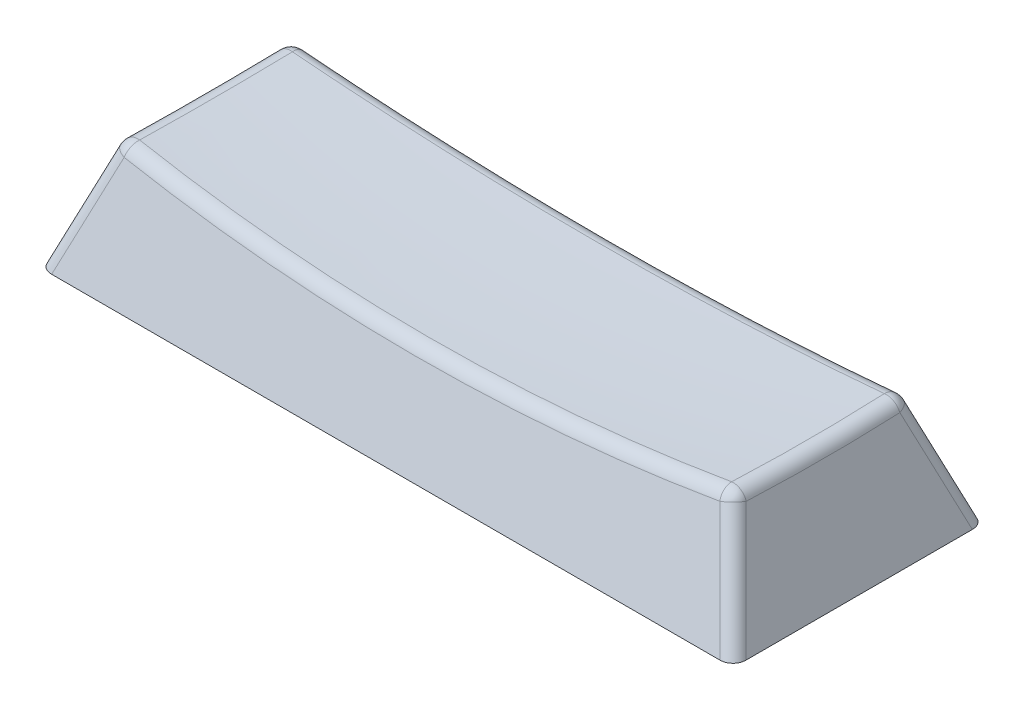
ISO-10303-21;
HEADER;
FILE_DESCRIPTION(('STEP AP214'),'2;1');
FILE_NAME('part.step','',(''),(''),'','','');
FILE_SCHEMA(('AUTOMOTIVE_DESIGN { 1 0 10303 214 1 1 1 1 }'));
ENDSEC;
DATA;
#1=APPLICATION_CONTEXT('core data for automotive mechanical design processes');
#2=APPLICATION_PROTOCOL_DEFINITION('international standard','automotive_design',2000,#1);
#3=PRODUCT_CONTEXT('',#1,'mechanical');
#4=PRODUCT('Part','Part','',(#3));
#5=PRODUCT_RELATED_PRODUCT_CATEGORY('part','',(#4));
#6=PRODUCT_DEFINITION_FORMATION('','',#4);
#7=PRODUCT_DEFINITION_CONTEXT('part definition',#1,'design');
#8=PRODUCT_DEFINITION('design','',#6,#7);
#9=PRODUCT_DEFINITION_SHAPE('','',#8);
#10=(LENGTH_UNIT() NAMED_UNIT(*) SI_UNIT(.MILLI.,.METRE.));
#11=(NAMED_UNIT(*) PLANE_ANGLE_UNIT() SI_UNIT($,.RADIAN.));
#12=(NAMED_UNIT(*) SI_UNIT($,.STERADIAN.) SOLID_ANGLE_UNIT());
#13=UNCERTAINTY_MEASURE_WITH_UNIT(LENGTH_MEASURE(1.E-05),#10,'distance_accuracy_value','');
#14=(GEOMETRIC_REPRESENTATION_CONTEXT(3) GLOBAL_UNCERTAINTY_ASSIGNED_CONTEXT((#13)) GLOBAL_UNIT_ASSIGNED_CONTEXT((#10,
#11,#12)) REPRESENTATION_CONTEXT('',''));
#15=CARTESIAN_POINT('',(0.,0.,0.));
#16=DIRECTION('',(0.,0.,1.));
#17=DIRECTION('',(1.,0.,0.));
#18=AXIS2_PLACEMENT_3D('',#15,#16,#17);
#19=CARTESIAN_POINT('',(-24.75,0.,9.));
#20=DIRECTION('',(-0.941470544812038,0.337095258423083,0.));
#21=DIRECTION('',(-0.337095258423083,-0.941470544812038,0.));
#22=AXIS2_PLACEMENT_3D('',#19,#20,#21);
#23=PLANE('',#22);
#24=DIRECTION('',(0.,0.,1.));
#25=VECTOR('',#24,1.);
#26=CARTESIAN_POINT('',(-24.75,0.,9.));
#27=LINE('',#26,#25);
#28=CARTESIAN_POINT('',(-24.75,0.,-8.05852945518796));
#29=VERTEX_POINT('',#28);
#30=CARTESIAN_POINT('',(-24.75,0.,8.05852945518797));
#31=VERTEX_POINT('',#30);
#32=EDGE_CURVE('E332',#29,#31,#27,.T.);
#33=ORIENTED_EDGE('',*,*,#32,.T.);
#34=DIRECTION('',(0.319434306340419,0.892145418564502,-0.31943430634042));
#35=VECTOR('',#34,1.);
#36=CARTESIAN_POINT('',(-24.8460660313606,-0.268302020343255,8.15459548654862));
#37=LINE('',#36,#35);
#38=CARTESIAN_POINT('',(-22.1671326449072,7.2136687633988,5.47566210009516));
#39=VERTEX_POINT('',#38);
#40=EDGE_CURVE('E364',#31,#39,#37,.T.);
#41=ORIENTED_EDGE('',*,*,#40,.T.);
#42=CARTESIAN_POINT('',(30.8648031415513,155.326121340973,0.));
#43=DIRECTION('',(-0.941470544812038,0.337095258423083,0.));
#44=DIRECTION('',(-0.337095258423083,-0.941470544812038,0.));
#45=AXIS2_PLACEMENT_3D('',#42,#43,#44);
#46=CIRCLE('',#45,157.415589117589);
#47=CARTESIAN_POINT('',(-22.1671326449072,7.21366876339883,-5.47566210009517));
#48=VERTEX_POINT('',#47);
#49=EDGE_CURVE('E360',#39,#48,#46,.F.);
#50=ORIENTED_EDGE('',*,*,#49,.T.);
#51=DIRECTION('',(0.319434306340419,0.892145418564502,0.319434306340419));
#52=VECTOR('',#51,1.);
#53=CARTESIAN_POINT('',(-23.0093770621513,4.86137133246757,-6.31790651733929));
#54=LINE('',#53,#52);
#55=EDGE_CURVE('E362',#48,#29,#54,.F.);
#56=ORIENTED_EDGE('',*,*,#55,.T.);
#57=EDGE_LOOP('',(#33,#41,#50,#56));
#58=FACE_BOUND('',#57,.T.);
#59=ADVANCED_FACE('F35',(#58),#23,.T.);
#60=CARTESIAN_POINT('',(24.75,0.,9.));
#61=DIRECTION('',(0.,0.337095258423083,0.941470544812038));
#62=DIRECTION('',(0.,-0.941470544812038,0.337095258423083));
#63=AXIS2_PLACEMENT_3D('',#60,#61,#62);
#64=PLANE('',#63);
#65=CARTESIAN_POINT('',(0.,150.327618549506,-44.8250800328429));
#66=DIRECTION('',(0.,0.337095258423083,0.941470544812038));
#67=DIRECTION('',(0.,-0.941470544812038,0.337095258423083));
#68=AXIS2_PLACEMENT_3D('',#65,#66,#67);
#69=CIRCLE('',#68,153.485816006169);
#70=CARTESIAN_POINT('',(21.2256621000952,7.2136687633988,6.4171326449072));
#71=VERTEX_POINT('',#70);
#72=CARTESIAN_POINT('',(-21.2256621000952,7.21366876339878,6.41713264490721));
#73=VERTEX_POINT('',#72);
#74=EDGE_CURVE('E347',#71,#73,#69,.F.);
#75=ORIENTED_EDGE('',*,*,#74,.T.);
#76=DIRECTION('',(0.31943430634042,0.892145418564502,-0.31943430634042));
#77=VECTOR('',#76,1.);
#78=CARTESIAN_POINT('',(-18.853700821223,13.8382996998865,4.045171366035));
#79=LINE('',#78,#77);
#80=CARTESIAN_POINT('',(-23.808529455188,0.,9.));
#81=VERTEX_POINT('',#80);
#82=EDGE_CURVE('E349',#73,#81,#79,.F.);
#83=ORIENTED_EDGE('',*,*,#82,.T.);
#84=DIRECTION('',(1.,0.,0.));
#85=VECTOR('',#84,1.);
#86=CARTESIAN_POINT('',(24.75,0.,9.));
#87=LINE('',#86,#85);
#88=CARTESIAN_POINT('',(23.808529455188,0.,9.));
#89=VERTEX_POINT('',#88);
#90=EDGE_CURVE('E335',#81,#89,#87,.T.);
#91=ORIENTED_EDGE('',*,*,#90,.T.);
#92=DIRECTION('',(-0.319434306340419,0.892145418564502,-0.319434306340419));
#93=VECTOR('',#92,1.);
#94=CARTESIAN_POINT('',(23.9045954865486,-0.268302020343256,9.09606603136065));
#95=LINE('',#94,#93);
#96=EDGE_CURVE('E345',#89,#71,#95,.T.);
#97=ORIENTED_EDGE('',*,*,#96,.T.);
#98=EDGE_LOOP('',(#75,#83,#91,#97));
#99=FACE_BOUND('',#98,.T.);
#100=ADVANCED_FACE('F455',(#99),#64,.T.);
#101=CARTESIAN_POINT('',(24.75,0.,9.));
#102=DIRECTION('',(0.941470544812038,0.337095258423083,0.));
#103=DIRECTION('',(-0.337095258423083,0.941470544812038,0.));
#104=AXIS2_PLACEMENT_3D('',#101,#102,#103);
#105=PLANE('',#104);
#106=CARTESIAN_POINT('',(-30.8648031415513,155.326121340973,0.));
#107=DIRECTION('',(0.941470544812038,0.337095258423083,0.));
#108=DIRECTION('',(-0.337095258423083,0.941470544812038,0.));
#109=AXIS2_PLACEMENT_3D('',#106,#107,#108);
#110=CIRCLE('',#109,157.415589117589);
#111=CARTESIAN_POINT('',(22.1671326449072,7.21366876339878,-5.47566210009518));
#112=VERTEX_POINT('',#111);
#113=CARTESIAN_POINT('',(22.1671326449072,7.21366876339882,5.47566210009517));
#114=VERTEX_POINT('',#113);
#115=EDGE_CURVE('E383',#112,#114,#110,.F.);
#116=ORIENTED_EDGE('',*,*,#115,.T.);
#117=DIRECTION('',(-0.319434306340419,0.892145418564502,-0.319434306340419));
#118=VECTOR('',#117,1.);
#119=CARTESIAN_POINT('',(24.8460660313607,-0.268302020343255,8.15459548654861));
#120=LINE('',#119,#118);
#121=CARTESIAN_POINT('',(24.75,0.,8.05852945518796));
#122=VERTEX_POINT('',#121);
#123=EDGE_CURVE('E43',#114,#122,#120,.F.);
#124=ORIENTED_EDGE('',*,*,#123,.T.);
#125=DIRECTION('',(0.,0.,-1.));
#126=VECTOR('',#125,1.);
#127=CARTESIAN_POINT('',(24.75,0.,9.));
#128=LINE('',#127,#126);
#129=CARTESIAN_POINT('',(24.75,0.,-8.05852945518797));
#130=VERTEX_POINT('',#129);
#131=EDGE_CURVE('E339',#122,#130,#128,.T.);
#132=ORIENTED_EDGE('',*,*,#131,.T.);
#133=DIRECTION('',(-0.319434306340419,0.892145418564502,0.31943430634042));
#134=VECTOR('',#133,1.);
#135=CARTESIAN_POINT('',(23.0093770621513,4.86137133246757,-6.31790651733929));
#136=LINE('',#135,#134);
#137=EDGE_CURVE('E381',#130,#112,#136,.T.);
#138=ORIENTED_EDGE('',*,*,#137,.T.);
#139=EDGE_LOOP('',(#116,#124,#132,#138));
#140=FACE_BOUND('',#139,.T.);
#141=ADVANCED_FACE('F443',(#140),#105,.T.);
#142=CARTESIAN_POINT('',(24.75,0.,-9.));
#143=DIRECTION('',(0.,0.337095258423083,-0.941470544812038));
#144=DIRECTION('',(0.,0.941470544812038,0.337095258423083));
#145=AXIS2_PLACEMENT_3D('',#142,#143,#144);
#146=PLANE('',#145);
#147=DIRECTION('',(-1.,0.,0.));
#148=VECTOR('',#147,1.);
#149=CARTESIAN_POINT('',(24.75,0.,-9.));
#150=LINE('',#149,#148);
#151=CARTESIAN_POINT('',(23.808529455188,0.,-9.));
#152=VERTEX_POINT('',#151);
#153=CARTESIAN_POINT('',(-23.808529455188,0.,-9.));
#154=VERTEX_POINT('',#153);
#155=EDGE_CURVE('E342',#152,#154,#150,.T.);
#156=ORIENTED_EDGE('',*,*,#155,.T.);
#157=DIRECTION('',(0.319434306340419,0.892145418564502,0.319434306340419));
#158=VECTOR('',#157,1.);
#159=CARTESIAN_POINT('',(-18.853700821223,13.8382996998865,-4.045171366035));
#160=LINE('',#159,#158);
#161=CARTESIAN_POINT('',(-21.2256621000952,7.21366876339879,-6.41713264490721));
#162=VERTEX_POINT('',#161);
#163=EDGE_CURVE('E370',#154,#162,#160,.T.);
#164=ORIENTED_EDGE('',*,*,#163,.T.);
#165=CARTESIAN_POINT('',(0.,150.327618549506,44.8250800328429));
#166=DIRECTION('',(0.,0.337095258423083,-0.941470544812038));
#167=DIRECTION('',(0.,0.941470544812038,0.337095258423083));
#168=AXIS2_PLACEMENT_3D('',#165,#166,#167);
#169=CIRCLE('',#168,153.485816006169);
#170=CARTESIAN_POINT('',(21.2256621000952,7.2136687633988,-6.41713264490721));
#171=VERTEX_POINT('',#170);
#172=EDGE_CURVE('E368',#162,#171,#169,.F.);
#173=ORIENTED_EDGE('',*,*,#172,.T.);
#174=DIRECTION('',(-0.31943430634042,0.892145418564502,0.31943430634042));
#175=VECTOR('',#174,1.);
#176=CARTESIAN_POINT('',(23.9045954865486,-0.268302020343257,-9.09606603136066));
#177=LINE('',#176,#175);
#178=EDGE_CURVE('E366',#171,#152,#177,.F.);
#179=ORIENTED_EDGE('',*,*,#178,.T.);
#180=EDGE_LOOP('',(#156,#164,#173,#179));
#181=FACE_BOUND('',#180,.T.);
#182=ADVANCED_FACE('F498',(#181),#146,.T.);
#183=CARTESIAN_POINT('',(0.,0.,0.));
#184=DIRECTION('',(0.,1.,0.));
#185=DIRECTION('',(0.,0.,1.));
#186=AXIS2_PLACEMENT_3D('',#183,#184,#185);
#187=PLANE('',#186);
#188=DIRECTION('',(0.,0.,-1.));
#189=VECTOR('',#188,1.);
#190=CARTESIAN_POINT('',(-23.1567478177987,0.,9.));
#191=LINE('',#190,#189);
#192=CARTESIAN_POINT('',(-23.1567478177987,0.,-7.40674781779872));
#193=VERTEX_POINT('',#192);
#194=CARTESIAN_POINT('',(-23.1567478177987,0.,7.40674781779873));
#195=VERTEX_POINT('',#194);
#196=EDGE_CURVE('E318',#193,#195,#191,.F.);
#197=ORIENTED_EDGE('',*,*,#196,.T.);
#198=DIRECTION('',(-1.,0.,0.));
#199=VECTOR('',#198,1.);
#200=CARTESIAN_POINT('',(24.75,0.,7.40674781779872));
#201=LINE('',#200,#199);
#202=CARTESIAN_POINT('',(23.1567478177987,0.,7.40674781779872));
#203=VERTEX_POINT('',#202);
#204=EDGE_CURVE('E326',#195,#203,#201,.F.);
#205=ORIENTED_EDGE('',*,*,#204,.T.);
#206=DIRECTION('',(0.,0.,1.));
#207=VECTOR('',#206,1.);
#208=CARTESIAN_POINT('',(23.1567478177987,0.,9.));
#209=LINE('',#208,#207);
#210=CARTESIAN_POINT('',(23.1567478177987,0.,-7.40674781779873));
#211=VERTEX_POINT('',#210);
#212=EDGE_CURVE('E328',#203,#211,#209,.F.);
#213=ORIENTED_EDGE('',*,*,#212,.T.);
#214=DIRECTION('',(1.,0.,0.));
#215=VECTOR('',#214,1.);
#216=CARTESIAN_POINT('',(24.75,0.,-7.40674781779873));
#217=LINE('',#216,#215);
#218=EDGE_CURVE('E214',#211,#193,#217,.F.);
#219=ORIENTED_EDGE('',*,*,#218,.T.);
#220=EDGE_LOOP('',(#197,#205,#213,#219));
#221=FACE_BOUND('',#220,.T.);
#222=ORIENTED_EDGE('',*,*,#90,.F.);
#223=CARTESIAN_POINT('',(-23.6878318785325,0.,7.93783187853249));
#224=DIRECTION('',(0.,1.,0.));
#225=DIRECTION('',(-0.707106781186547,0.,0.707106781186548));
#226=AXIS2_PLACEMENT_3D('',#223,#224,#225);
#227=ELLIPSE('',#226,1.12089349918878,1.);
#228=EDGE_CURVE('E358',#81,#31,#227,.F.);
#229=ORIENTED_EDGE('',*,*,#228,.T.);
#230=ORIENTED_EDGE('',*,*,#32,.F.);
#231=CARTESIAN_POINT('',(-23.6878318785325,0.,-7.93783187853249));
#232=DIRECTION('',(0.,1.,0.));
#233=DIRECTION('',(-0.707106781186548,0.,-0.707106781186547));
#234=AXIS2_PLACEMENT_3D('',#231,#232,#233);
#235=ELLIPSE('',#234,1.12089349918878,1.);
#236=EDGE_CURVE('E356',#29,#154,#235,.F.);
#237=ORIENTED_EDGE('',*,*,#236,.T.);
#238=ORIENTED_EDGE('',*,*,#155,.F.);
#239=CARTESIAN_POINT('',(23.6878318785325,0.,-7.93783187853249));
#240=DIRECTION('',(0.,1.,0.));
#241=DIRECTION('',(0.707106781186547,0.,-0.707106781186548));
#242=AXIS2_PLACEMENT_3D('',#239,#240,#241);
#243=ELLIPSE('',#242,1.12089349918878,1.);
#244=EDGE_CURVE('E352',#152,#130,#243,.F.);
#245=ORIENTED_EDGE('',*,*,#244,.T.);
#246=ORIENTED_EDGE('',*,*,#131,.F.);
#247=CARTESIAN_POINT('',(23.6878318785325,0.,7.93783187853248));
#248=DIRECTION('',(0.,1.,0.));
#249=DIRECTION('',(0.707106781186548,0.,0.707106781186547));
#250=AXIS2_PLACEMENT_3D('',#247,#248,#249);
#251=ELLIPSE('',#250,1.12089349918878,1.);
#252=EDGE_CURVE('E354',#122,#89,#251,.F.);
#253=ORIENTED_EDGE('',*,*,#252,.T.);
#254=EDGE_LOOP('',(#222,#229,#230,#237,#238,#245,#246,#253));
#255=FACE_BOUND('',#254,.T.);
#256=ADVANCED_FACE('F453',(#221,#255),#187,.F.);
#257=CARTESIAN_POINT('',(0.,166.377320816636,0.));
#258=DIRECTION('',(0.962876907951971,0.,0.269940845617798));
#259=DIRECTION('',(0.,1.,0.));
#260=AXIS2_PLACEMENT_3D('',#257,#258,#259);
#261=SPHERICAL_SURFACE('',#260,160.);
#262=CARTESIAN_POINT('',(0.,150.092304642173,45.4822862883528));
#263=DIRECTION('',(0.,0.337095258423083,-0.941470544812038));
#264=DIRECTION('',(0.,0.941470544812038,0.337095258423083));
#265=AXIS2_PLACEMENT_3D('',#262,#263,#264);
#266=CIRCLE('',#265,152.532487956441);
#267=CARTESIAN_POINT('',(21.0938256895356,7.86726137647671,-5.44165177649209));
#268=VERTEX_POINT('',#267);
#269=CARTESIAN_POINT('',(-21.0938256895356,7.86726137647673,-5.44165177649209));
#270=VERTEX_POINT('',#269);
#271=EDGE_CURVE('E372',#268,#270,#266,.T.);
#272=ORIENTED_EDGE('',*,*,#271,.T.);
#273=CARTESIAN_POINT('',(31.608719191417,155.059760832451,0.));
#274=DIRECTION('',(-0.941470544812038,0.337095258423083,0.));
#275=DIRECTION('',(-0.337095258423083,-0.941470544812038,0.));
#276=AXIS2_PLACEMENT_3D('',#273,#274,#275);
#277=CIRCLE('',#276,156.437852539219);
#278=CARTESIAN_POINT('',(-21.0938256895356,7.86726137647673,5.44165177649209));
#279=VERTEX_POINT('',#278);
#280=EDGE_CURVE('E378',#270,#279,#277,.T.);
#281=ORIENTED_EDGE('',*,*,#280,.T.);
#282=CARTESIAN_POINT('',(0.,150.092304642173,-45.4822862883528));
#283=DIRECTION('',(0.,0.337095258423083,0.941470544812038));
#284=DIRECTION('',(0.,-0.941470544812038,0.337095258423083));
#285=AXIS2_PLACEMENT_3D('',#282,#283,#284);
#286=CIRCLE('',#285,152.532487956441);
#287=CARTESIAN_POINT('',(21.0938256895356,7.86726137647673,5.44165177649209));
#288=VERTEX_POINT('',#287);
#289=EDGE_CURVE('E376',#279,#288,#286,.T.);
#290=ORIENTED_EDGE('',*,*,#289,.T.);
#291=CARTESIAN_POINT('',(-31.608719191417,155.059760832451,0.));
#292=DIRECTION('',(0.941470544812038,0.337095258423083,0.));
#293=DIRECTION('',(-0.337095258423083,0.941470544812038,0.));
#294=AXIS2_PLACEMENT_3D('',#291,#292,#293);
#295=CIRCLE('',#294,156.437852539219);
#296=EDGE_CURVE('E374',#288,#268,#295,.T.);
#297=ORIENTED_EDGE('',*,*,#296,.T.);
#298=EDGE_LOOP('',(#272,#281,#290,#297));
#299=FACE_BOUND('',#298,.T.);
#300=ADVANCED_FACE('F434',(#299),#261,.F.);
#301=CARTESIAN_POINT('',(23.9045954865486,-0.605397278766339,-8.15459548654862));
#302=DIRECTION('',(0.31943430634042,-0.892145418564502,-0.31943430634042));
#303=DIRECTION('',(0.,0.337095258423083,-0.941470544812038));
#304=AXIS2_PLACEMENT_3D('',#301,#302,#303);
#305=CYLINDRICAL_SURFACE('',#304,1.);
#306=CARTESIAN_POINT('',(21.2256621000952,6.8765735049757,-5.47566210009518));
#307=DIRECTION('',(-0.319434306340418,0.892145418564497,0.319434306340435));
#308=DIRECTION('',(0.,-0.337095258423099,0.941470544812032));
#309=AXIS2_PLACEMENT_3D('',#306,#307,#308);
#310=CIRCLE('',#309,1.);
#311=EDGE_CURVE('E336',#112,#171,#310,.T.);
#312=ORIENTED_EDGE('',*,*,#311,.F.);
#313=ORIENTED_EDGE('',*,*,#137,.F.);
#314=ORIENTED_EDGE('',*,*,#244,.F.);
#315=ORIENTED_EDGE('',*,*,#178,.F.);
#316=EDGE_LOOP('',(#312,#313,#314,#315));
#317=FACE_BOUND('',#316,.T.);
#318=ADVANCED_FACE('F37',(#317),#305,.T.);
#319=CARTESIAN_POINT('',(21.2256621000952,6.87657350497574,-5.47566210009516));
#320=DIRECTION('',(0.,0.,1.));
#321=DIRECTION('',(1.,0.,0.));
#322=AXIS2_PLACEMENT_3D('',#319,#320,#321);
#323=SPHERICAL_SURFACE('',#322,1.);
#324=CARTESIAN_POINT('',(21.2256621000952,6.87657350497572,-5.47566210009516));
#325=DIRECTION('',(-0.0117257746899046,0.0327488186492892,-0.999394827425577));
#326=DIRECTION('',(0.,0.999463539803605,0.0327510702611099));
#327=AXIS2_PLACEMENT_3D('',#324,#325,#326);
#328=CIRCLE('',#327,1.);
#329=EDGE_CURVE('E411',#112,#268,#328,.F.);
#330=ORIENTED_EDGE('',*,*,#329,.F.);
#331=ORIENTED_EDGE('',*,*,#311,.T.);
#332=CARTESIAN_POINT('',(21.2256621000952,6.87657350497571,-5.47566210009517));
#333=DIRECTION('',(0.990391680192753,0.130196627814589,0.0466171418116274));
#334=DIRECTION('',(-0.130338327724509,0.991469576097007,0.));
#335=AXIS2_PLACEMENT_3D('',#332,#333,#334);
#336=CIRCLE('',#335,1.);
#337=EDGE_CURVE('E414',#268,#171,#336,.F.);
#338=ORIENTED_EDGE('',*,*,#337,.F.);
#339=EDGE_LOOP('',(#330,#331,#338));
#340=FACE_BOUND('',#339,.T.);
#341=ADVANCED_FACE('F421',(#340),#323,.T.);
#342=CARTESIAN_POINT('',(-22.0679065173393,4.52427607404449,-6.31790651733929));
#343=DIRECTION('',(-0.31943430634042,-0.892145418564502,-0.319434306340419));
#344=DIRECTION('',(0.941470544812038,-0.337095258423083,0.));
#345=AXIS2_PLACEMENT_3D('',#342,#343,#344);
#346=CYLINDRICAL_SURFACE('',#345,1.);
#347=ORIENTED_EDGE('',*,*,#236,.F.);
#348=ORIENTED_EDGE('',*,*,#55,.F.);
#349=CARTESIAN_POINT('',(-21.2256621000952,6.87657350497571,-5.47566210009517));
#350=DIRECTION('',(0.319434306340427,0.892145418564499,0.319434306340419));
#351=DIRECTION('',(-0.941470544812035,0.337095258423091,0.));
#352=AXIS2_PLACEMENT_3D('',#349,#350,#351);
#353=CIRCLE('',#352,1.);
#354=EDGE_CURVE('E408',#162,#48,#353,.T.);
#355=ORIENTED_EDGE('',*,*,#354,.F.);
#356=ORIENTED_EDGE('',*,*,#163,.F.);
#357=EDGE_LOOP('',(#347,#348,#355,#356));
#358=FACE_BOUND('',#357,.T.);
#359=ADVANCED_FACE('F469',(#358),#346,.T.);
#360=CARTESIAN_POINT('',(0.,149.990523291082,45.766550577655));
#361=DIRECTION('',(0.,0.337095258423083,-0.941470544812038));
#362=DIRECTION('',(0.,0.941470544812038,0.337095258423083));
#363=AXIS2_PLACEMENT_3D('',#360,#361,#362);
#364=TOROIDAL_SURFACE('',#363,153.485816006169,1.);
#365=ORIENTED_EDGE('',*,*,#337,.T.);
#366=ORIENTED_EDGE('',*,*,#172,.F.);
#367=CARTESIAN_POINT('',(-21.2256621000952,6.87657350497573,-5.47566210009517));
#368=DIRECTION('',(-0.990391680192753,0.130196627814582,0.0466171418116366));
#369=DIRECTION('',(-0.130338327724503,-0.991469576097008,0.));
#370=AXIS2_PLACEMENT_3D('',#367,#368,#369);
#371=CIRCLE('',#370,1.);
#372=EDGE_CURVE('E405',#270,#162,#371,.T.);
#373=ORIENTED_EDGE('',*,*,#372,.F.);
#374=ORIENTED_EDGE('',*,*,#271,.F.);
#375=EDGE_LOOP('',(#365,#366,#373,#374));
#376=FACE_BOUND('',#375,.T.);
#377=ADVANCED_FACE('F429',(#376),#364,.T.);
#378=CARTESIAN_POINT('',(-31.8062736863633,154.98902608255,0.));
#379=DIRECTION('',(0.941470544812038,0.337095258423083,0.));
#380=DIRECTION('',(-0.337095258423083,0.941470544812038,0.));
#381=AXIS2_PLACEMENT_3D('',#378,#379,#380);
#382=TOROIDAL_SURFACE('',#381,157.415589117589,1.);
#383=ORIENTED_EDGE('',*,*,#329,.T.);
#384=ORIENTED_EDGE('',*,*,#296,.F.);
#385=CARTESIAN_POINT('',(21.2256621000952,6.87657350497574,5.47566210009517));
#386=DIRECTION('',(-0.0117257746898878,0.0327488186492865,0.999394827425577));
#387=DIRECTION('',(0.,-0.999463539803605,0.0327510702611072));
#388=AXIS2_PLACEMENT_3D('',#385,#386,#387);
#389=CIRCLE('',#388,1.);
#390=EDGE_CURVE('E402',#114,#288,#389,.T.);
#391=ORIENTED_EDGE('',*,*,#390,.F.);
#392=ORIENTED_EDGE('',*,*,#115,.F.);
#393=EDGE_LOOP('',(#383,#384,#391,#392));
#394=FACE_BOUND('',#393,.T.);
#395=ADVANCED_FACE('F440',(#394),#382,.T.);
#396=CARTESIAN_POINT('',(23.9045954865486,-0.605397278766338,8.15459548654861));
#397=DIRECTION('',(0.31943430634042,-0.892145418564502,0.319434306340419));
#398=DIRECTION('',(0.941470544812038,0.337095258423083,0.));
#399=AXIS2_PLACEMENT_3D('',#396,#397,#398);
#400=CYLINDRICAL_SURFACE('',#399,1.);
#401=ORIENTED_EDGE('',*,*,#252,.F.);
#402=ORIENTED_EDGE('',*,*,#123,.F.);
#403=CARTESIAN_POINT('',(21.2256621000952,6.87657350497572,5.47566210009517));
#404=DIRECTION('',(-0.319434306340419,0.892145418564502,-0.31943430634042));
#405=DIRECTION('',(0.,0.337095258423083,0.941470544812038));
#406=AXIS2_PLACEMENT_3D('',#403,#404,#405);
#407=CIRCLE('',#406,1.);
#408=EDGE_CURVE('E399',#71,#114,#407,.T.);
#409=ORIENTED_EDGE('',*,*,#408,.F.);
#410=ORIENTED_EDGE('',*,*,#96,.F.);
#411=EDGE_LOOP('',(#401,#402,#409,#410));
#412=FACE_BOUND('',#411,.T.);
#413=ADVANCED_FACE('F448',(#412),#400,.T.);
#414=CARTESIAN_POINT('',(-21.2256621000952,6.87657350497573,-5.47566210009516));
#415=DIRECTION('',(0.,0.,1.));
#416=DIRECTION('',(1.,0.,0.));
#417=AXIS2_PLACEMENT_3D('',#414,#415,#416);
#418=SPHERICAL_SURFACE('',#417,1.);
#419=ORIENTED_EDGE('',*,*,#372,.T.);
#420=ORIENTED_EDGE('',*,*,#354,.T.);
#421=CARTESIAN_POINT('',(-21.2256621000952,6.87657350497574,-5.47566210009517));
#422=DIRECTION('',(0.0117257746898917,0.0327488186492973,-0.999394827425576));
#423=DIRECTION('',(0.,0.999463539803605,0.0327510702611181));
#424=AXIS2_PLACEMENT_3D('',#421,#422,#423);
#425=CIRCLE('',#424,1.);
#426=EDGE_CURVE('E396',#270,#48,#425,.F.);
#427=ORIENTED_EDGE('',*,*,#426,.F.);
#428=EDGE_LOOP('',(#419,#420,#427));
#429=FACE_BOUND('',#428,.T.);
#430=ADVANCED_FACE('F472',(#429),#418,.T.);
#431=CARTESIAN_POINT('',(21.2256621000952,6.87657350497573,5.47566210009516));
#432=DIRECTION('',(0.,0.,1.));
#433=DIRECTION('',(1.,0.,0.));
#434=AXIS2_PLACEMENT_3D('',#431,#432,#433);
#435=SPHERICAL_SURFACE('',#434,1.);
#436=ORIENTED_EDGE('',*,*,#408,.T.);
#437=ORIENTED_EDGE('',*,*,#390,.T.);
#438=CARTESIAN_POINT('',(21.2256621000952,6.87657350497573,5.47566210009517));
#439=DIRECTION('',(0.990391680192754,0.130196627814583,-0.0466171418116268));
#440=DIRECTION('',(-0.130338327724503,0.991469576097008,0.));
#441=AXIS2_PLACEMENT_3D('',#438,#439,#440);
#442=CIRCLE('',#441,1.);
#443=EDGE_CURVE('E393',#71,#288,#442,.F.);
#444=ORIENTED_EDGE('',*,*,#443,.F.);
#445=EDGE_LOOP('',(#436,#437,#444));
#446=FACE_BOUND('',#445,.T.);
#447=ADVANCED_FACE('F480',(#446),#435,.T.);
#448=CARTESIAN_POINT('',(31.8062736863634,154.98902608255,0.));
#449=DIRECTION('',(-0.941470544812038,0.337095258423083,0.));
#450=DIRECTION('',(-0.337095258423083,-0.941470544812038,0.));
#451=AXIS2_PLACEMENT_3D('',#448,#449,#450);
#452=TOROIDAL_SURFACE('',#451,157.415589117589,1.);
#453=ORIENTED_EDGE('',*,*,#426,.T.);
#454=ORIENTED_EDGE('',*,*,#49,.F.);
#455=CARTESIAN_POINT('',(-21.2256621000952,6.87657350497573,5.47566210009516));
#456=DIRECTION('',(0.0117257746898913,0.0327488186492909,0.999394827425577));
#457=DIRECTION('',(0.,-0.999463539803605,0.0327510702611117));
#458=AXIS2_PLACEMENT_3D('',#455,#456,#457);
#459=CIRCLE('',#458,1.);
#460=EDGE_CURVE('E390',#279,#39,#459,.T.);
#461=ORIENTED_EDGE('',*,*,#460,.F.);
#462=ORIENTED_EDGE('',*,*,#280,.F.);
#463=EDGE_LOOP('',(#453,#454,#461,#462));
#464=FACE_BOUND('',#463,.T.);
#465=ADVANCED_FACE('F474',(#464),#452,.T.);
#466=CARTESIAN_POINT('',(0.,149.990523291082,-45.766550577655));
#467=DIRECTION('',(0.,0.337095258423083,0.941470544812038));
#468=DIRECTION('',(0.,-0.941470544812038,0.337095258423083));
#469=AXIS2_PLACEMENT_3D('',#466,#467,#468);
#470=TOROIDAL_SURFACE('',#469,153.485816006169,1.);
#471=ORIENTED_EDGE('',*,*,#443,.T.);
#472=ORIENTED_EDGE('',*,*,#289,.F.);
#473=CARTESIAN_POINT('',(-21.2256621000952,6.8765735049757,5.47566210009518));
#474=DIRECTION('',(-0.990391680192752,0.130196627814592,-0.0466171418116285));
#475=DIRECTION('',(-0.130338327724512,-0.991469576097007,0.));
#476=AXIS2_PLACEMENT_3D('',#473,#474,#475);
#477=CIRCLE('',#476,1.);
#478=EDGE_CURVE('E388',#73,#279,#477,.T.);
#479=ORIENTED_EDGE('',*,*,#478,.F.);
#480=ORIENTED_EDGE('',*,*,#74,.F.);
#481=EDGE_LOOP('',(#471,#472,#479,#480));
#482=FACE_BOUND('',#481,.T.);
#483=ADVANCED_FACE('F478',(#482),#470,.T.);
#484=CARTESIAN_POINT('',(-21.2256621000952,6.87657350497572,5.47566210009517));
#485=DIRECTION('',(0.,0.,1.));
#486=DIRECTION('',(1.,0.,0.));
#487=AXIS2_PLACEMENT_3D('',#484,#485,#486);
#488=SPHERICAL_SURFACE('',#487,1.);
#489=ORIENTED_EDGE('',*,*,#478,.T.);
#490=ORIENTED_EDGE('',*,*,#460,.T.);
#491=CARTESIAN_POINT('',(-21.2256621000952,6.87657350497574,5.47566210009516));
#492=DIRECTION('',(0.319434306340424,0.892145418564514,-0.31943430634038));
#493=DIRECTION('',(-0.941470544812038,0.337095258423083,0.));
#494=AXIS2_PLACEMENT_3D('',#491,#492,#493);
#495=CIRCLE('',#494,1.);
#496=EDGE_CURVE('E322',#73,#39,#495,.F.);
#497=ORIENTED_EDGE('',*,*,#496,.F.);
#498=EDGE_LOOP('',(#489,#490,#497));
#499=FACE_BOUND('',#498,.T.);
#500=ADVANCED_FACE('F507',(#499),#488,.T.);
#501=CARTESIAN_POINT('',(-18.853700821223,13.5012044414634,3.10370082122296));
#502=DIRECTION('',(-0.31943430634042,-0.892145418564502,0.31943430634042));
#503=DIRECTION('',(0.,-0.337095258423083,-0.941470544812038));
#504=AXIS2_PLACEMENT_3D('',#501,#502,#503);
#505=CYLINDRICAL_SURFACE('',#504,1.);
#506=ORIENTED_EDGE('',*,*,#496,.T.);
#507=ORIENTED_EDGE('',*,*,#40,.F.);
#508=ORIENTED_EDGE('',*,*,#228,.F.);
#509=ORIENTED_EDGE('',*,*,#82,.F.);
#510=EDGE_LOOP('',(#506,#507,#508,#509));
#511=FACE_BOUND('',#510,.T.);
#512=ADVANCED_FACE('F460',(#511),#505,.T.);
#513=CARTESIAN_POINT('',(-23.3377941827819,-0.505642887634624,9.));
#514=DIRECTION('',(-0.941470544812038,0.337095258423083,0.));
#515=DIRECTION('',(-0.337095258423083,-0.941470544812038,0.));
#516=AXIS2_PLACEMENT_3D('',#513,#514,#515);
#517=PLANE('',#516);
#518=DIRECTION('',(0.,0.,-1.));
#519=VECTOR('',#518,1.);
#520=CARTESIAN_POINT('',(-21.4515259422057,4.7625,0.));
#521=LINE('',#520,#519);
#522=CARTESIAN_POINT('',(-21.4515259422057,4.7625,-5.70152594220574));
#523=VERTEX_POINT('',#522);
#524=CARTESIAN_POINT('',(-21.4515259422057,4.7625,5.70152594220574));
#525=VERTEX_POINT('',#524);
#526=EDGE_CURVE('E50',#523,#525,#521,.F.);
#527=ORIENTED_EDGE('',*,*,#526,.T.);
#528=DIRECTION('',(0.31943430634042,0.892145418564502,-0.31943430634042));
#529=VECTOR('',#528,1.);
#530=CARTESIAN_POINT('',(-23.4818932298229,-0.908095918149508,7.73189322982292));
#531=LINE('',#530,#529);
#532=EDGE_CURVE('E219',#195,#525,#531,.T.);
#533=ORIENTED_EDGE('',*,*,#532,.F.);
#534=ORIENTED_EDGE('',*,*,#196,.F.);
#535=DIRECTION('',(-0.31943430634042,-0.892145418564502,-0.319434306340419));
#536=VECTOR('',#535,1.);
#537=CARTESIAN_POINT('',(-21.6452042606136,4.22157743466132,-5.89520426061359));
#538=LINE('',#537,#536);
#539=EDGE_CURVE('E320',#523,#193,#538,.T.);
#540=ORIENTED_EDGE('',*,*,#539,.F.);
#541=EDGE_LOOP('',(#527,#533,#534,#540));
#542=FACE_BOUND('',#541,.T.);
#543=ADVANCED_FACE('F506',(#542),#517,.F.);
#544=CARTESIAN_POINT('',(24.75,-0.505642887634624,7.58779418278194));
#545=DIRECTION('',(0.,0.337095258423083,0.941470544812038));
#546=DIRECTION('',(0.,-0.941470544812038,0.337095258423083));
#547=AXIS2_PLACEMENT_3D('',#544,#545,#546);
#548=PLANE('',#547);
#549=DIRECTION('',(-1.,0.,0.));
#550=VECTOR('',#549,1.);
#551=CARTESIAN_POINT('',(0.,4.7625,5.70152594220574));
#552=LINE('',#551,#550);
#553=CARTESIAN_POINT('',(21.4515259422057,4.7625,5.70152594220574));
#554=VERTEX_POINT('',#553);
#555=EDGE_CURVE('E57',#525,#554,#552,.F.);
#556=ORIENTED_EDGE('',*,*,#555,.T.);
#557=DIRECTION('',(0.31943430634042,-0.892145418564502,0.319434306340419));
#558=VECTOR('',#557,1.);
#559=CARTESIAN_POINT('',(23.4818932298229,-0.908095918149508,7.73189322982292));
#560=LINE('',#559,#558);
#561=EDGE_CURVE('E218',#554,#203,#560,.T.);
#562=ORIENTED_EDGE('',*,*,#561,.T.);
#563=ORIENTED_EDGE('',*,*,#204,.F.);
#564=ORIENTED_EDGE('',*,*,#532,.T.);
#565=EDGE_LOOP('',(#556,#562,#563,#564));
#566=FACE_BOUND('',#565,.T.);
#567=ADVANCED_FACE('F530',(#566),#548,.F.);
#568=CARTESIAN_POINT('',(23.3377941827819,-0.505642887634624,9.));
#569=DIRECTION('',(0.941470544812038,0.337095258423083,0.));
#570=DIRECTION('',(-0.337095258423083,0.941470544812038,0.));
#571=AXIS2_PLACEMENT_3D('',#568,#569,#570);
#572=PLANE('',#571);
#573=DIRECTION('',(0.,0.,1.));
#574=VECTOR('',#573,1.);
#575=CARTESIAN_POINT('',(21.4515259422057,4.7625,0.));
#576=LINE('',#575,#574);
#577=CARTESIAN_POINT('',(21.4515259422057,4.7625,-5.70152594220574));
#578=VERTEX_POINT('',#577);
#579=EDGE_CURVE('E222',#554,#578,#576,.F.);
#580=ORIENTED_EDGE('',*,*,#579,.T.);
#581=DIRECTION('',(-0.31943430634042,0.892145418564502,0.31943430634042));
#582=VECTOR('',#581,1.);
#583=CARTESIAN_POINT('',(21.6452042606136,4.22157743466132,-5.8952042606136));
#584=LINE('',#583,#582);
#585=EDGE_CURVE('E208',#211,#578,#584,.T.);
#586=ORIENTED_EDGE('',*,*,#585,.F.);
#587=ORIENTED_EDGE('',*,*,#212,.F.);
#588=ORIENTED_EDGE('',*,*,#561,.F.);
#589=EDGE_LOOP('',(#580,#586,#587,#588));
#590=FACE_BOUND('',#589,.T.);
#591=ADVANCED_FACE('F223',(#590),#572,.F.);
#592=CARTESIAN_POINT('',(24.75,-0.505642887634624,-7.58779418278195));
#593=DIRECTION('',(0.,0.337095258423083,-0.941470544812038));
#594=DIRECTION('',(0.,0.941470544812038,0.337095258423083));
#595=AXIS2_PLACEMENT_3D('',#592,#593,#594);
#596=PLANE('',#595);
#597=DIRECTION('',(1.,0.,0.));
#598=VECTOR('',#597,1.);
#599=CARTESIAN_POINT('',(0.,4.7625,-5.70152594220574));
#600=LINE('',#599,#598);
#601=EDGE_CURVE('E212',#578,#523,#600,.F.);
#602=ORIENTED_EDGE('',*,*,#601,.T.);
#603=ORIENTED_EDGE('',*,*,#539,.T.);
#604=ORIENTED_EDGE('',*,*,#218,.F.);
#605=ORIENTED_EDGE('',*,*,#585,.T.);
#606=EDGE_LOOP('',(#602,#603,#604,#605));
#607=FACE_BOUND('',#606,.T.);
#608=ADVANCED_FACE('F210',(#607),#596,.F.);
#609=CARTESIAN_POINT('',(0.,4.7625,0.));
#610=DIRECTION('',(0.,-1.,0.));
#611=DIRECTION('',(0.,0.,-1.));
#612=AXIS2_PLACEMENT_3D('',#609,#610,#611);
#613=PLANE('',#612);
#614=CARTESIAN_POINT('',(0.,4.7625,0.));
#615=DIRECTION('',(0.,-1.,0.));
#616=DIRECTION('',(0.,0.,-1.));
#617=AXIS2_PLACEMENT_3D('',#614,#615,#616);
#618=CIRCLE('',#617,2.75);
#619=CARTESIAN_POINT('',(0.,4.7625,-2.75));
#620=VERTEX_POINT('',#619);
#621=EDGE_CURVE('E11',#620,#620,#618,.F.);
#622=ORIENTED_EDGE('',*,*,#621,.T.);
#623=EDGE_LOOP('',(#622));
#624=FACE_BOUND('',#623,.T.);
#625=ORIENTED_EDGE('',*,*,#579,.F.);
#626=ORIENTED_EDGE('',*,*,#555,.F.);
#627=ORIENTED_EDGE('',*,*,#526,.F.);
#628=ORIENTED_EDGE('',*,*,#601,.F.);
#629=EDGE_LOOP('',(#625,#626,#627,#628));
#630=FACE_BOUND('',#629,.T.);
#631=ADVANCED_FACE('F226',(#624,#630),#613,.T.);
#632=CARTESIAN_POINT('',(0.,4.7625,0.));
#633=DIRECTION('',(0.,-1.,0.));
#634=DIRECTION('',(0.,0.,-1.));
#635=AXIS2_PLACEMENT_3D('',#632,#633,#634);
#636=PLANE('',#635);
#637=DIRECTION('',(1.,0.,0.));
#638=VECTOR('',#637,1.);
#639=CARTESIAN_POINT('',(0.,4.7625,-2.05));
#640=LINE('',#639,#638);
#641=CARTESIAN_POINT('',(-0.55,4.7625,-2.05));
#642=VERTEX_POINT('',#641);
#643=CARTESIAN_POINT('',(0.550000000000001,4.7625,-2.05));
#644=VERTEX_POINT('',#643);
#645=EDGE_CURVE('E251',#642,#644,#640,.T.);
#646=ORIENTED_EDGE('',*,*,#645,.T.);
#647=DIRECTION('',(0.,0.,1.));
#648=VECTOR('',#647,1.);
#649=CARTESIAN_POINT('',(0.550000000000001,4.7625,0.));
#650=LINE('',#649,#648);
#651=CARTESIAN_POINT('',(0.550000000000001,4.7625,-0.55));
#652=VERTEX_POINT('',#651);
#653=EDGE_CURVE('E253',#644,#652,#650,.T.);
#654=ORIENTED_EDGE('',*,*,#653,.T.);
#655=DIRECTION('',(1.,0.,0.));
#656=VECTOR('',#655,1.);
#657=CARTESIAN_POINT('',(0.,4.7625,-0.55));
#658=LINE('',#657,#656);
#659=CARTESIAN_POINT('',(2.05,4.7625,-0.55));
#660=VERTEX_POINT('',#659);
#661=EDGE_CURVE('E233',#652,#660,#658,.T.);
#662=ORIENTED_EDGE('',*,*,#661,.T.);
#663=DIRECTION('',(0.,0.,1.));
#664=VECTOR('',#663,1.);
#665=CARTESIAN_POINT('',(2.05,4.7625,0.));
#666=LINE('',#665,#664);
#667=CARTESIAN_POINT('',(2.05,4.7625,0.55));
#668=VERTEX_POINT('',#667);
#669=EDGE_CURVE('E228',#660,#668,#666,.T.);
#670=ORIENTED_EDGE('',*,*,#669,.T.);
#671=DIRECTION('',(-1.,0.,0.));
#672=VECTOR('',#671,1.);
#673=CARTESIAN_POINT('',(0.,4.7625,0.55));
#674=LINE('',#673,#672);
#675=CARTESIAN_POINT('',(0.55,4.7625,0.55));
#676=VERTEX_POINT('',#675);
#677=EDGE_CURVE('E235',#668,#676,#674,.T.);
#678=ORIENTED_EDGE('',*,*,#677,.T.);
#679=DIRECTION('',(0.,0.,1.));
#680=VECTOR('',#679,1.);
#681=CARTESIAN_POINT('',(0.550000000000001,4.7625,0.));
#682=LINE('',#681,#680);
#683=CARTESIAN_POINT('',(0.55,4.7625,2.05));
#684=VERTEX_POINT('',#683);
#685=EDGE_CURVE('E237',#676,#684,#682,.T.);
#686=ORIENTED_EDGE('',*,*,#685,.T.);
#687=DIRECTION('',(-1.,0.,0.));
#688=VECTOR('',#687,1.);
#689=CARTESIAN_POINT('',(0.,4.7625,2.05));
#690=LINE('',#689,#688);
#691=CARTESIAN_POINT('',(-0.55,4.7625,2.05));
#692=VERTEX_POINT('',#691);
#693=EDGE_CURVE('E239',#684,#692,#690,.T.);
#694=ORIENTED_EDGE('',*,*,#693,.T.);
#695=DIRECTION('',(0.,0.,-1.));
#696=VECTOR('',#695,1.);
#697=CARTESIAN_POINT('',(-0.55,4.7625,0.));
#698=LINE('',#697,#696);
#699=CARTESIAN_POINT('',(-0.55,4.7625,0.55));
#700=VERTEX_POINT('',#699);
#701=EDGE_CURVE('E241',#692,#700,#698,.T.);
#702=ORIENTED_EDGE('',*,*,#701,.T.);
#703=DIRECTION('',(-1.,0.,0.));
#704=VECTOR('',#703,1.);
#705=CARTESIAN_POINT('',(0.,4.7625,0.55));
#706=LINE('',#705,#704);
#707=CARTESIAN_POINT('',(-2.05,4.7625,0.55));
#708=VERTEX_POINT('',#707);
#709=EDGE_CURVE('E243',#700,#708,#706,.T.);
#710=ORIENTED_EDGE('',*,*,#709,.T.);
#711=DIRECTION('',(0.,0.,-1.));
#712=VECTOR('',#711,1.);
#713=CARTESIAN_POINT('',(-2.05,4.7625,0.));
#714=LINE('',#713,#712);
#715=CARTESIAN_POINT('',(-2.05,4.7625,-0.550000000000001));
#716=VERTEX_POINT('',#715);
#717=EDGE_CURVE('E245',#708,#716,#714,.T.);
#718=ORIENTED_EDGE('',*,*,#717,.T.);
#719=DIRECTION('',(1.,0.,0.));
#720=VECTOR('',#719,1.);
#721=CARTESIAN_POINT('',(0.,4.7625,-0.55));
#722=LINE('',#721,#720);
#723=CARTESIAN_POINT('',(-0.55,4.7625,-0.55));
#724=VERTEX_POINT('',#723);
#725=EDGE_CURVE('E247',#716,#724,#722,.T.);
#726=ORIENTED_EDGE('',*,*,#725,.T.);
#727=DIRECTION('',(0.,0.,-1.));
#728=VECTOR('',#727,1.);
#729=CARTESIAN_POINT('',(-0.55,4.7625,0.));
#730=LINE('',#729,#728);
#731=EDGE_CURVE('E249',#724,#642,#730,.T.);
#732=ORIENTED_EDGE('',*,*,#731,.T.);
#733=EDGE_LOOP('',(#646,#654,#662,#670,#678,#686,#694,#702,#710,#718,#726,#732));
#734=FACE_BOUND('',#733,.T.);
#735=ADVANCED_FACE('F556',(#734),#636,.T.);
#736=CARTESIAN_POINT('',(0.55,7.87757350497574,0.55));
#737=DIRECTION('',(0.,0.,1.));
#738=DIRECTION('',(1.,0.,0.));
#739=AXIS2_PLACEMENT_3D('',#736,#737,#738);
#740=PLANE('',#739);
#741=DIRECTION('',(0.,-1.,0.));
#742=VECTOR('',#741,1.);
#743=CARTESIAN_POINT('',(0.55,7.87757350497574,0.55));
#744=LINE('',#743,#742);
#745=CARTESIAN_POINT('',(0.55,0.,0.55));
#746=VERTEX_POINT('',#745);
#747=EDGE_CURVE('E313',#676,#746,#744,.T.);
#748=ORIENTED_EDGE('',*,*,#747,.F.);
#749=ORIENTED_EDGE('',*,*,#677,.F.);
#750=DIRECTION('',(0.,-1.,0.));
#751=VECTOR('',#750,1.);
#752=CARTESIAN_POINT('',(2.05,7.87757350497574,0.55));
#753=LINE('',#752,#751);
#754=CARTESIAN_POINT('',(2.05,0.,0.55));
#755=VERTEX_POINT('',#754);
#756=EDGE_CURVE('E291',#668,#755,#753,.T.);
#757=ORIENTED_EDGE('',*,*,#756,.T.);
#758=DIRECTION('',(-1.,0.,0.));
#759=VECTOR('',#758,1.);
#760=CARTESIAN_POINT('',(0.55,0.,0.55));
#761=LINE('',#760,#759);
#762=EDGE_CURVE('E255',#755,#746,#761,.T.);
#763=ORIENTED_EDGE('',*,*,#762,.T.);
#764=EDGE_LOOP('',(#748,#749,#757,#763));
#765=FACE_BOUND('',#764,.T.);
#766=ADVANCED_FACE('F564',(#765),#740,.F.);
#767=CARTESIAN_POINT('',(0.55,7.87757350497574,2.05));
#768=DIRECTION('',(1.,0.,0.));
#769=DIRECTION('',(0.,0.,-1.));
#770=AXIS2_PLACEMENT_3D('',#767,#768,#769);
#771=PLANE('',#770);
#772=DIRECTION('',(0.,-1.,0.));
#773=VECTOR('',#772,1.);
#774=CARTESIAN_POINT('',(0.55,7.87757350497574,2.05));
#775=LINE('',#774,#773);
#776=CARTESIAN_POINT('',(0.55,0.,2.05));
#777=VERTEX_POINT('',#776);
#778=EDGE_CURVE('E311',#684,#777,#775,.T.);
#779=ORIENTED_EDGE('',*,*,#778,.F.);
#780=ORIENTED_EDGE('',*,*,#685,.F.);
#781=ORIENTED_EDGE('',*,*,#747,.T.);
#782=DIRECTION('',(0.,0.,1.));
#783=VECTOR('',#782,1.);
#784=CARTESIAN_POINT('',(0.55,0.,2.05));
#785=LINE('',#784,#783);
#786=EDGE_CURVE('E258',#746,#777,#785,.T.);
#787=ORIENTED_EDGE('',*,*,#786,.T.);
#788=EDGE_LOOP('',(#779,#780,#781,#787));
#789=FACE_BOUND('',#788,.T.);
#790=ADVANCED_FACE('F572',(#789),#771,.F.);
#791=CARTESIAN_POINT('',(-0.55,7.87757350497574,2.05));
#792=DIRECTION('',(0.,0.,1.));
#793=DIRECTION('',(1.,0.,0.));
#794=AXIS2_PLACEMENT_3D('',#791,#792,#793);
#795=PLANE('',#794);
#796=DIRECTION('',(0.,-1.,0.));
#797=VECTOR('',#796,1.);
#798=CARTESIAN_POINT('',(-0.55,7.87757350497574,2.05));
#799=LINE('',#798,#797);
#800=CARTESIAN_POINT('',(-0.55,0.,2.05));
#801=VERTEX_POINT('',#800);
#802=EDGE_CURVE('E309',#692,#801,#799,.T.);
#803=ORIENTED_EDGE('',*,*,#802,.F.);
#804=ORIENTED_EDGE('',*,*,#693,.F.);
#805=ORIENTED_EDGE('',*,*,#778,.T.);
#806=DIRECTION('',(-1.,0.,0.));
#807=VECTOR('',#806,1.);
#808=CARTESIAN_POINT('',(-0.55,0.,2.05));
#809=LINE('',#808,#807);
#810=EDGE_CURVE('E261',#777,#801,#809,.T.);
#811=ORIENTED_EDGE('',*,*,#810,.T.);
#812=EDGE_LOOP('',(#803,#804,#805,#811));
#813=FACE_BOUND('',#812,.T.);
#814=ADVANCED_FACE('F580',(#813),#795,.F.);
#815=CARTESIAN_POINT('',(-0.55,7.87757350497574,0.55));
#816=DIRECTION('',(-1.,0.,0.));
#817=DIRECTION('',(0.,0.,1.));
#818=AXIS2_PLACEMENT_3D('',#815,#816,#817);
#819=PLANE('',#818);
#820=DIRECTION('',(0.,-1.,0.));
#821=VECTOR('',#820,1.);
#822=CARTESIAN_POINT('',(-0.55,7.87757350497574,0.55));
#823=LINE('',#822,#821);
#824=CARTESIAN_POINT('',(-0.55,0.,0.55));
#825=VERTEX_POINT('',#824);
#826=EDGE_CURVE('E307',#700,#825,#823,.T.);
#827=ORIENTED_EDGE('',*,*,#826,.F.);
#828=ORIENTED_EDGE('',*,*,#701,.F.);
#829=ORIENTED_EDGE('',*,*,#802,.T.);
#830=DIRECTION('',(0.,0.,-1.));
#831=VECTOR('',#830,1.);
#832=CARTESIAN_POINT('',(-0.55,0.,0.55));
#833=LINE('',#832,#831);
#834=EDGE_CURVE('E264',#801,#825,#833,.T.);
#835=ORIENTED_EDGE('',*,*,#834,.T.);
#836=EDGE_LOOP('',(#827,#828,#829,#835));
#837=FACE_BOUND('',#836,.T.);
#838=ADVANCED_FACE('F588',(#837),#819,.F.);
#839=CARTESIAN_POINT('',(-2.05,7.87757350497574,0.55));
#840=DIRECTION('',(0.,0.,1.));
#841=DIRECTION('',(1.,0.,0.));
#842=AXIS2_PLACEMENT_3D('',#839,#840,#841);
#843=PLANE('',#842);
#844=DIRECTION('',(0.,-1.,0.));
#845=VECTOR('',#844,1.);
#846=CARTESIAN_POINT('',(-2.05,7.87757350497574,0.55));
#847=LINE('',#846,#845);
#848=CARTESIAN_POINT('',(-2.05,0.,0.55));
#849=VERTEX_POINT('',#848);
#850=EDGE_CURVE('E305',#708,#849,#847,.T.);
#851=ORIENTED_EDGE('',*,*,#850,.F.);
#852=ORIENTED_EDGE('',*,*,#709,.F.);
#853=ORIENTED_EDGE('',*,*,#826,.T.);
#854=DIRECTION('',(-1.,0.,0.));
#855=VECTOR('',#854,1.);
#856=CARTESIAN_POINT('',(-2.05,0.,0.55));
#857=LINE('',#856,#855);
#858=EDGE_CURVE('E267',#825,#849,#857,.T.);
#859=ORIENTED_EDGE('',*,*,#858,.T.);
#860=EDGE_LOOP('',(#851,#852,#853,#859));
#861=FACE_BOUND('',#860,.T.);
#862=ADVANCED_FACE('F596',(#861),#843,.F.);
#863=CARTESIAN_POINT('',(-2.05,7.87757350497574,-0.550000000000001));
#864=DIRECTION('',(-1.,0.,0.));
#865=DIRECTION('',(0.,0.,1.));
#866=AXIS2_PLACEMENT_3D('',#863,#864,#865);
#867=PLANE('',#866);
#868=DIRECTION('',(0.,-1.,0.));
#869=VECTOR('',#868,1.);
#870=CARTESIAN_POINT('',(-2.05,7.87757350497574,-0.550000000000001));
#871=LINE('',#870,#869);
#872=CARTESIAN_POINT('',(-2.05,0.,-0.550000000000001));
#873=VERTEX_POINT('',#872);
#874=EDGE_CURVE('E303',#716,#873,#871,.T.);
#875=ORIENTED_EDGE('',*,*,#874,.F.);
#876=ORIENTED_EDGE('',*,*,#717,.F.);
#877=ORIENTED_EDGE('',*,*,#850,.T.);
#878=DIRECTION('',(0.,0.,-1.));
#879=VECTOR('',#878,1.);
#880=CARTESIAN_POINT('',(-2.05,0.,-0.550000000000001));
#881=LINE('',#880,#879);
#882=EDGE_CURVE('E270',#849,#873,#881,.T.);
#883=ORIENTED_EDGE('',*,*,#882,.T.);
#884=EDGE_LOOP('',(#875,#876,#877,#883));
#885=FACE_BOUND('',#884,.T.);
#886=ADVANCED_FACE('F604',(#885),#867,.F.);
#887=CARTESIAN_POINT('',(-0.55,7.87757350497574,-0.55));
#888=DIRECTION('',(0.,0.,-1.));
#889=DIRECTION('',(-1.,0.,0.));
#890=AXIS2_PLACEMENT_3D('',#887,#888,#889);
#891=PLANE('',#890);
#892=DIRECTION('',(0.,-1.,0.));
#893=VECTOR('',#892,1.);
#894=CARTESIAN_POINT('',(-0.55,7.87757350497574,-0.55));
#895=LINE('',#894,#893);
#896=CARTESIAN_POINT('',(-0.55,0.,-0.55));
#897=VERTEX_POINT('',#896);
#898=EDGE_CURVE('E301',#724,#897,#895,.T.);
#899=ORIENTED_EDGE('',*,*,#898,.F.);
#900=ORIENTED_EDGE('',*,*,#725,.F.);
#901=ORIENTED_EDGE('',*,*,#874,.T.);
#902=DIRECTION('',(1.,0.,0.));
#903=VECTOR('',#902,1.);
#904=CARTESIAN_POINT('',(-0.55,0.,-0.55));
#905=LINE('',#904,#903);
#906=EDGE_CURVE('E273',#873,#897,#905,.T.);
#907=ORIENTED_EDGE('',*,*,#906,.T.);
#908=EDGE_LOOP('',(#899,#900,#901,#907));
#909=FACE_BOUND('',#908,.T.);
#910=ADVANCED_FACE('F612',(#909),#891,.F.);
#911=CARTESIAN_POINT('',(-0.55,7.87757350497574,-2.05));
#912=DIRECTION('',(-1.,0.,0.));
#913=DIRECTION('',(0.,0.,1.));
#914=AXIS2_PLACEMENT_3D('',#911,#912,#913);
#915=PLANE('',#914);
#916=DIRECTION('',(0.,-1.,0.));
#917=VECTOR('',#916,1.);
#918=CARTESIAN_POINT('',(-0.55,7.87757350497574,-2.05));
#919=LINE('',#918,#917);
#920=CARTESIAN_POINT('',(-0.55,0.,-2.05));
#921=VERTEX_POINT('',#920);
#922=EDGE_CURVE('E299',#642,#921,#919,.T.);
#923=ORIENTED_EDGE('',*,*,#922,.F.);
#924=ORIENTED_EDGE('',*,*,#731,.F.);
#925=ORIENTED_EDGE('',*,*,#898,.T.);
#926=DIRECTION('',(0.,0.,-1.));
#927=VECTOR('',#926,1.);
#928=CARTESIAN_POINT('',(-0.55,0.,-2.05));
#929=LINE('',#928,#927);
#930=EDGE_CURVE('E276',#897,#921,#929,.T.);
#931=ORIENTED_EDGE('',*,*,#930,.T.);
#932=EDGE_LOOP('',(#923,#924,#925,#931));
#933=FACE_BOUND('',#932,.T.);
#934=ADVANCED_FACE('F620',(#933),#915,.F.);
#935=CARTESIAN_POINT('',(0.550000000000001,7.87757350497574,-2.05));
#936=DIRECTION('',(0.,0.,-1.));
#937=DIRECTION('',(-1.,0.,0.));
#938=AXIS2_PLACEMENT_3D('',#935,#936,#937);
#939=PLANE('',#938);
#940=DIRECTION('',(0.,-1.,0.));
#941=VECTOR('',#940,1.);
#942=CARTESIAN_POINT('',(0.550000000000001,7.87757350497574,-2.05));
#943=LINE('',#942,#941);
#944=CARTESIAN_POINT('',(0.550000000000001,0.,-2.05));
#945=VERTEX_POINT('',#944);
#946=EDGE_CURVE('E297',#644,#945,#943,.T.);
#947=ORIENTED_EDGE('',*,*,#946,.F.);
#948=ORIENTED_EDGE('',*,*,#645,.F.);
#949=ORIENTED_EDGE('',*,*,#922,.T.);
#950=DIRECTION('',(1.,0.,0.));
#951=VECTOR('',#950,1.);
#952=CARTESIAN_POINT('',(0.550000000000001,0.,-2.05));
#953=LINE('',#952,#951);
#954=EDGE_CURVE('E279',#921,#945,#953,.T.);
#955=ORIENTED_EDGE('',*,*,#954,.T.);
#956=EDGE_LOOP('',(#947,#948,#949,#955));
#957=FACE_BOUND('',#956,.T.);
#958=ADVANCED_FACE('F628',(#957),#939,.F.);
#959=CARTESIAN_POINT('',(0.550000000000001,7.87757350497574,-0.55));
#960=DIRECTION('',(1.,0.,0.));
#961=DIRECTION('',(0.,0.,-1.));
#962=AXIS2_PLACEMENT_3D('',#959,#960,#961);
#963=PLANE('',#962);
#964=DIRECTION('',(0.,-1.,0.));
#965=VECTOR('',#964,1.);
#966=CARTESIAN_POINT('',(0.550000000000001,7.87757350497574,-0.55));
#967=LINE('',#966,#965);
#968=CARTESIAN_POINT('',(0.550000000000001,0.,-0.55));
#969=VERTEX_POINT('',#968);
#970=EDGE_CURVE('E295',#652,#969,#967,.T.);
#971=ORIENTED_EDGE('',*,*,#970,.F.);
#972=ORIENTED_EDGE('',*,*,#653,.F.);
#973=ORIENTED_EDGE('',*,*,#946,.T.);
#974=DIRECTION('',(0.,0.,1.));
#975=VECTOR('',#974,1.);
#976=CARTESIAN_POINT('',(0.550000000000001,0.,-0.55));
#977=LINE('',#976,#975);
#978=EDGE_CURVE('E282',#945,#969,#977,.T.);
#979=ORIENTED_EDGE('',*,*,#978,.T.);
#980=EDGE_LOOP('',(#971,#972,#973,#979));
#981=FACE_BOUND('',#980,.T.);
#982=ADVANCED_FACE('F636',(#981),#963,.F.);
#983=CARTESIAN_POINT('',(2.05,7.87757350497574,-0.55));
#984=DIRECTION('',(0.,0.,-1.));
#985=DIRECTION('',(-1.,0.,0.));
#986=AXIS2_PLACEMENT_3D('',#983,#984,#985);
#987=PLANE('',#986);
#988=DIRECTION('',(0.,-1.,0.));
#989=VECTOR('',#988,1.);
#990=CARTESIAN_POINT('',(2.05,7.87757350497574,-0.55));
#991=LINE('',#990,#989);
#992=CARTESIAN_POINT('',(2.05,0.,-0.55));
#993=VERTEX_POINT('',#992);
#994=EDGE_CURVE('E292',#660,#993,#991,.T.);
#995=ORIENTED_EDGE('',*,*,#994,.F.);
#996=ORIENTED_EDGE('',*,*,#661,.F.);
#997=ORIENTED_EDGE('',*,*,#970,.T.);
#998=DIRECTION('',(1.,0.,0.));
#999=VECTOR('',#998,1.);
#1000=CARTESIAN_POINT('',(2.05,0.,-0.55));
#1001=LINE('',#1000,#999);
#1002=EDGE_CURVE('E285',#969,#993,#1001,.T.);
#1003=ORIENTED_EDGE('',*,*,#1002,.T.);
#1004=EDGE_LOOP('',(#995,#996,#997,#1003));
#1005=FACE_BOUND('',#1004,.T.);
#1006=ADVANCED_FACE('F644',(#1005),#987,.F.);
#1007=CARTESIAN_POINT('',(2.05,7.87757350497574,0.));
#1008=DIRECTION('',(1.,0.,0.));
#1009=DIRECTION('',(0.,0.,-1.));
#1010=AXIS2_PLACEMENT_3D('',#1007,#1008,#1009);
#1011=PLANE('',#1010);
#1012=ORIENTED_EDGE('',*,*,#756,.F.);
#1013=ORIENTED_EDGE('',*,*,#669,.F.);
#1014=ORIENTED_EDGE('',*,*,#994,.T.);
#1015=DIRECTION('',(0.,0.,1.));
#1016=VECTOR('',#1015,1.);
#1017=CARTESIAN_POINT('',(2.05,0.,0.));
#1018=LINE('',#1017,#1016);
#1019=EDGE_CURVE('E288',#993,#755,#1018,.T.);
#1020=ORIENTED_EDGE('',*,*,#1019,.T.);
#1021=EDGE_LOOP('',(#1012,#1013,#1014,#1020));
#1022=FACE_BOUND('',#1021,.T.);
#1023=ADVANCED_FACE('F652',(#1022),#1011,.F.);
#1024=CARTESIAN_POINT('',(0.,0.,0.));
#1025=DIRECTION('',(0.,-1.,0.));
#1026=DIRECTION('',(0.,0.,-1.));
#1027=AXIS2_PLACEMENT_3D('',#1024,#1025,#1026);
#1028=PLANE('',#1027);
#1029=ORIENTED_EDGE('',*,*,#1019,.F.);
#1030=ORIENTED_EDGE('',*,*,#1002,.F.);
#1031=ORIENTED_EDGE('',*,*,#978,.F.);
#1032=ORIENTED_EDGE('',*,*,#954,.F.);
#1033=ORIENTED_EDGE('',*,*,#930,.F.);
#1034=ORIENTED_EDGE('',*,*,#906,.F.);
#1035=ORIENTED_EDGE('',*,*,#882,.F.);
#1036=ORIENTED_EDGE('',*,*,#858,.F.);
#1037=ORIENTED_EDGE('',*,*,#834,.F.);
#1038=ORIENTED_EDGE('',*,*,#810,.F.);
#1039=ORIENTED_EDGE('',*,*,#786,.F.);
#1040=ORIENTED_EDGE('',*,*,#762,.F.);
#1041=EDGE_LOOP('',(#1029,#1030,#1031,#1032,#1033,#1034,#1035,#1036,#1037,#1038,#1039,#1040));
#1042=FACE_BOUND('',#1041,.T.);
#1043=CARTESIAN_POINT('',(0.,0.,0.));
#1044=DIRECTION('',(0.,-1.,0.));
#1045=DIRECTION('',(0.,0.,-1.));
#1046=AXIS2_PLACEMENT_3D('',#1043,#1044,#1045);
#1047=CIRCLE('',#1046,2.75);
#1048=CARTESIAN_POINT('',(0.,0.,-2.75));
#1049=VERTEX_POINT('',#1048);
#1050=EDGE_CURVE('E294',#1049,#1049,#1047,.T.);
#1051=ORIENTED_EDGE('',*,*,#1050,.T.);
#1052=EDGE_LOOP('',(#1051));
#1053=FACE_BOUND('',#1052,.T.);
#1054=ADVANCED_FACE('F660',(#1042,#1053),#1028,.T.);
#1055=CARTESIAN_POINT('',(0.,7.87857350497572,0.));
#1056=DIRECTION('',(0.,-1.,0.));
#1057=DIRECTION('',(0.,0.,-1.));
#1058=AXIS2_PLACEMENT_3D('',#1055,#1056,#1057);
#1059=CYLINDRICAL_SURFACE('',#1058,2.75);
#1060=ORIENTED_EDGE('',*,*,#621,.F.);
#1061=EDGE_LOOP('',(#1060));
#1062=FACE_BOUND('',#1061,.T.);
#1063=ORIENTED_EDGE('',*,*,#1050,.F.);
#1064=EDGE_LOOP('',(#1063));
#1065=FACE_BOUND('',#1064,.T.);
#1066=ADVANCED_FACE('F668',(#1062,#1065),#1059,.T.);
#1067=CLOSED_SHELL('',(#59,#100,#141,#182,#256,#300,#318,#341,#359,#377,#395,#413,#430,#447,
#465,#483,#500,#512,#543,#567,#591,#608,#631,#735,#766,#790,#814,#838,#862,#886,#910,#934,#958,
#982,#1006,#1023,#1054,#1066));
#1068=MANIFOLD_SOLID_BREP('B2',#1067);
#1069=ADVANCED_BREP_SHAPE_REPRESENTATION('',(#18,#1068),#14);
#1070=SHAPE_DEFINITION_REPRESENTATION(#9,#1069);
ENDSEC;
END-ISO-10303-21;
